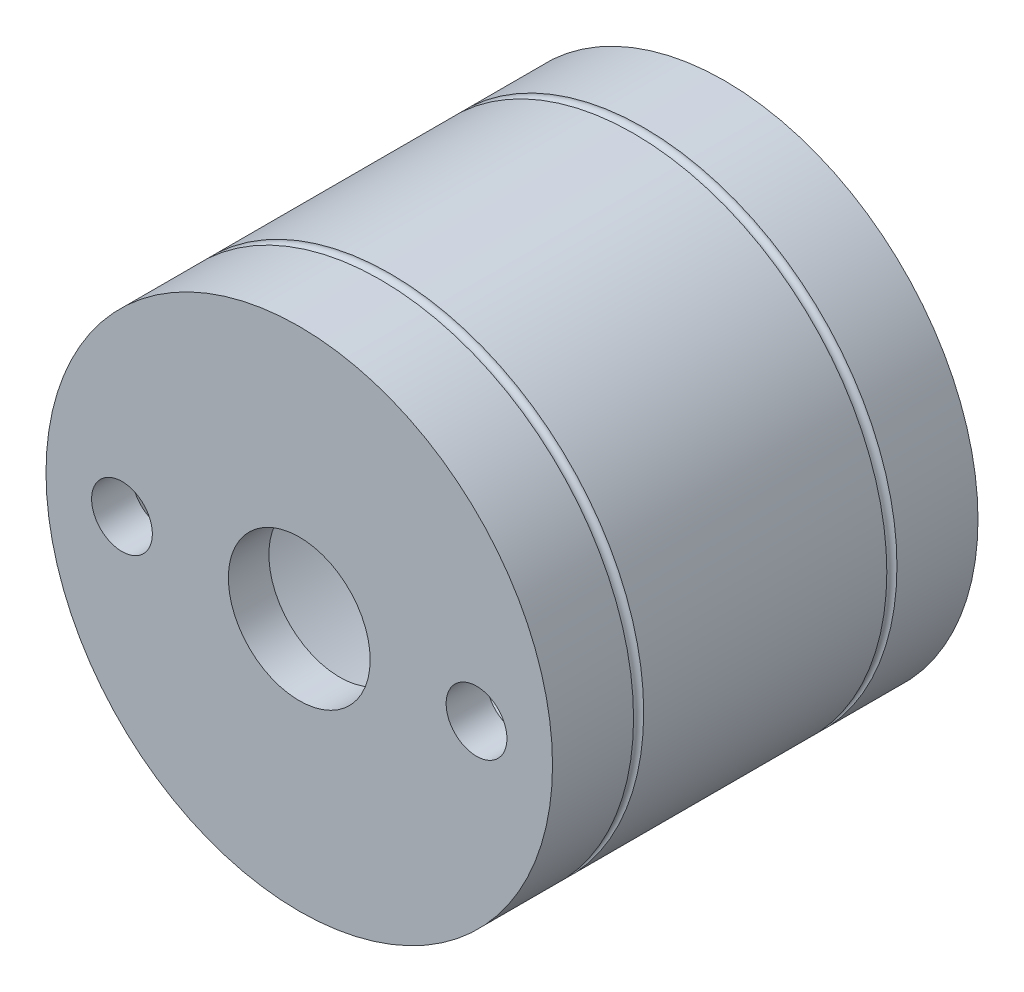
ISO-10303-21;
HEADER;
FILE_DESCRIPTION(('STEP AP214'),'2;1');
FILE_NAME('part.step','',(''),(''),'','','');
FILE_SCHEMA(('AUTOMOTIVE_DESIGN { 1 0 10303 214 1 1 1 1 }'));
ENDSEC;
DATA;
#1=APPLICATION_CONTEXT('core data for automotive mechanical design processes');
#2=APPLICATION_PROTOCOL_DEFINITION('international standard','automotive_design',2000,#1);
#3=PRODUCT_CONTEXT('',#1,'mechanical');
#4=PRODUCT('Part','Part','',(#3));
#5=PRODUCT_RELATED_PRODUCT_CATEGORY('part','',(#4));
#6=PRODUCT_DEFINITION_FORMATION('','',#4);
#7=PRODUCT_DEFINITION_CONTEXT('part definition',#1,'design');
#8=PRODUCT_DEFINITION('design','',#6,#7);
#9=PRODUCT_DEFINITION_SHAPE('','',#8);
#10=(LENGTH_UNIT() NAMED_UNIT(*) SI_UNIT(.MILLI.,.METRE.));
#11=(NAMED_UNIT(*) PLANE_ANGLE_UNIT() SI_UNIT($,.RADIAN.));
#12=(NAMED_UNIT(*) SI_UNIT($,.STERADIAN.) SOLID_ANGLE_UNIT());
#13=UNCERTAINTY_MEASURE_WITH_UNIT(LENGTH_MEASURE(1.E-05),#10,'distance_accuracy_value','');
#14=(GEOMETRIC_REPRESENTATION_CONTEXT(3) GLOBAL_UNCERTAINTY_ASSIGNED_CONTEXT((#13)) GLOBAL_UNIT_ASSIGNED_CONTEXT((#10,
#11,#12)) REPRESENTATION_CONTEXT('',''));
#15=CARTESIAN_POINT('',(0.,0.,0.));
#16=DIRECTION('',(0.,0.,1.));
#17=DIRECTION('',(1.,0.,0.));
#18=AXIS2_PLACEMENT_3D('',#15,#16,#17);
#19=CARTESIAN_POINT('',(0.,0.,21.));
#20=DIRECTION('',(0.,0.,-1.));
#21=DIRECTION('',(-1.,0.,0.));
#22=AXIS2_PLACEMENT_3D('',#19,#20,#21);
#23=CYLINDRICAL_SURFACE('',#22,12.5);
#24=CARTESIAN_POINT('',(0.,0.,4.));
#25=DIRECTION('',(0.,0.,1.));
#26=DIRECTION('',(1.,0.,0.));
#27=AXIS2_PLACEMENT_3D('',#24,#25,#26);
#28=CIRCLE('',#27,12.5);
#29=CARTESIAN_POINT('',(0.,12.5,4.));
#30=VERTEX_POINT('',#29);
#31=EDGE_CURVE('E11',#30,#30,#28,.F.);
#32=ORIENTED_EDGE('',*,*,#31,.T.);
#33=EDGE_LOOP('',(#32));
#34=FACE_BOUND('',#33,.T.);
#35=CARTESIAN_POINT('',(0.,0.,0.));
#36=DIRECTION('',(0.,0.,1.));
#37=DIRECTION('',(1.,0.,0.));
#38=AXIS2_PLACEMENT_3D('',#35,#36,#37);
#39=CIRCLE('',#38,12.5);
#40=CARTESIAN_POINT('',(12.5,0.,0.));
#41=VERTEX_POINT('',#40);
#42=EDGE_CURVE('E81',#41,#41,#39,.T.);
#43=ORIENTED_EDGE('',*,*,#42,.T.);
#44=EDGE_LOOP('',(#43));
#45=FACE_BOUND('',#44,.T.);
#46=ADVANCED_FACE('F32',(#34,#45),#23,.T.);
#47=CARTESIAN_POINT('',(0.,0.,21.));
#48=DIRECTION('',(0.,0.,1.));
#49=DIRECTION('',(1.,0.,0.));
#50=AXIS2_PLACEMENT_3D('',#47,#48,#49);
#51=CIRCLE('',#50,12.5);
#52=CARTESIAN_POINT('',(12.5,0.,21.));
#53=VERTEX_POINT('',#52);
#54=EDGE_CURVE('E85',#53,#53,#51,.T.);
#55=ORIENTED_EDGE('',*,*,#54,.F.);
#56=EDGE_LOOP('',(#55));
#57=FACE_BOUND('',#56,.T.);
#58=CARTESIAN_POINT('',(0.,0.,17.));
#59=DIRECTION('',(0.,0.,-1.));
#60=DIRECTION('',(-1.,0.,0.));
#61=AXIS2_PLACEMENT_3D('',#58,#59,#60);
#62=CIRCLE('',#61,12.5);
#63=CARTESIAN_POINT('',(0.,12.5,17.));
#64=VERTEX_POINT('',#63);
#65=EDGE_CURVE('E62',#64,#64,#62,.T.);
#66=ORIENTED_EDGE('',*,*,#65,.F.);
#67=EDGE_LOOP('',(#66));
#68=FACE_BOUND('',#67,.T.);
#69=ADVANCED_FACE('F34',(#57,#68),#23,.T.);
#70=CARTESIAN_POINT('',(0.,0.,4.5));
#71=DIRECTION('',(0.,0.,-1.));
#72=DIRECTION('',(-1.,0.,0.));
#73=AXIS2_PLACEMENT_3D('',#70,#71,#72);
#74=CIRCLE('',#73,12.5);
#75=CARTESIAN_POINT('',(0.,12.5,4.5));
#76=VERTEX_POINT('',#75);
#77=EDGE_CURVE('E40',#76,#76,#74,.F.);
#78=ORIENTED_EDGE('',*,*,#77,.T.);
#79=EDGE_LOOP('',(#78));
#80=FACE_BOUND('',#79,.T.);
#81=CARTESIAN_POINT('',(0.,0.,16.5));
#82=DIRECTION('',(0.,0.,1.));
#83=DIRECTION('',(1.,0.,0.));
#84=AXIS2_PLACEMENT_3D('',#81,#82,#83);
#85=CIRCLE('',#84,12.5);
#86=CARTESIAN_POINT('',(0.,12.5,16.5));
#87=VERTEX_POINT('',#86);
#88=EDGE_CURVE('E60',#87,#87,#85,.T.);
#89=ORIENTED_EDGE('',*,*,#88,.F.);
#90=EDGE_LOOP('',(#89));
#91=FACE_BOUND('',#90,.T.);
#92=ADVANCED_FACE('F99',(#80,#91),#23,.T.);
#93=CARTESIAN_POINT('',(0.,0.,21.));
#94=DIRECTION('',(0.,0.,1.));
#95=DIRECTION('',(1.,0.,0.));
#96=AXIS2_PLACEMENT_3D('',#93,#94,#95);
#97=PLANE('',#96);
#98=CARTESIAN_POINT('',(8.75,0.,21.));
#99=DIRECTION('',(0.,0.,1.));
#100=DIRECTION('',(1.,0.,0.));
#101=AXIS2_PLACEMENT_3D('',#98,#99,#100);
#102=CIRCLE('',#101,1.5);
#103=CARTESIAN_POINT('',(10.25,0.,21.));
#104=VERTEX_POINT('',#103);
#105=EDGE_CURVE('E66',#104,#104,#102,.T.);
#106=ORIENTED_EDGE('',*,*,#105,.F.);
#107=EDGE_LOOP('',(#106));
#108=FACE_BOUND('',#107,.T.);
#109=CARTESIAN_POINT('',(-8.75,0.,21.));
#110=DIRECTION('',(0.,0.,1.));
#111=DIRECTION('',(-1.,0.,0.));
#112=AXIS2_PLACEMENT_3D('',#109,#110,#111);
#113=CIRCLE('',#112,1.5);
#114=CARTESIAN_POINT('',(-7.25,0.,21.));
#115=VERTEX_POINT('',#114);
#116=EDGE_CURVE('E63',#115,#115,#113,.T.);
#117=ORIENTED_EDGE('',*,*,#116,.F.);
#118=EDGE_LOOP('',(#117));
#119=FACE_BOUND('',#118,.T.);
#120=CARTESIAN_POINT('',(0.,0.,21.));
#121=DIRECTION('',(0.,0.,1.));
#122=DIRECTION('',(1.,0.,0.));
#123=AXIS2_PLACEMENT_3D('',#120,#121,#122);
#124=CIRCLE('',#123,3.5);
#125=CARTESIAN_POINT('',(3.5,0.,21.));
#126=VERTEX_POINT('',#125);
#127=EDGE_CURVE('E73',#126,#126,#124,.T.);
#128=ORIENTED_EDGE('',*,*,#127,.F.);
#129=EDGE_LOOP('',(#128));
#130=FACE_BOUND('',#129,.T.);
#131=ORIENTED_EDGE('',*,*,#54,.T.);
#132=EDGE_LOOP('',(#131));
#133=FACE_BOUND('',#132,.T.);
#134=ADVANCED_FACE('F117',(#108,#119,#130,#133),#97,.T.);
#135=CARTESIAN_POINT('',(0.,0.,0.));
#136=DIRECTION('',(0.,0.,1.));
#137=DIRECTION('',(1.,0.,0.));
#138=AXIS2_PLACEMENT_3D('',#135,#136,#137);
#139=PLANE('',#138);
#140=CARTESIAN_POINT('',(0.,0.,0.));
#141=DIRECTION('',(0.,0.,1.));
#142=DIRECTION('',(1.,0.,0.));
#143=AXIS2_PLACEMENT_3D('',#140,#141,#142);
#144=CIRCLE('',#143,10.5);
#145=CARTESIAN_POINT('',(-10.5,0.,0.));
#146=VERTEX_POINT('',#145);
#147=EDGE_CURVE('E82',#146,#146,#144,.T.);
#148=ORIENTED_EDGE('',*,*,#147,.T.);
#149=EDGE_LOOP('',(#148));
#150=FACE_BOUND('',#149,.T.);
#151=ORIENTED_EDGE('',*,*,#42,.F.);
#152=EDGE_LOOP('',(#151));
#153=FACE_BOUND('',#152,.T.);
#154=ADVANCED_FACE('F121',(#150,#153),#139,.F.);
#155=CARTESIAN_POINT('',(0.,0.,21.));
#156=DIRECTION('',(0.,0.,-1.));
#157=DIRECTION('',(-1.,0.,0.));
#158=AXIS2_PLACEMENT_3D('',#155,#156,#157);
#159=CYLINDRICAL_SURFACE('',#158,10.5);
#160=CARTESIAN_POINT('',(0.,0.,19.));
#161=DIRECTION('',(0.,0.,1.));
#162=DIRECTION('',(1.,0.,0.));
#163=AXIS2_PLACEMENT_3D('',#160,#161,#162);
#164=CIRCLE('',#163,10.5);
#165=CARTESIAN_POINT('',(-10.5,0.,19.));
#166=VERTEX_POINT('',#165);
#167=EDGE_CURVE('E78',#166,#166,#164,.T.);
#168=CARTESIAN_POINT('',(-10.5,0.,19.));
#169=CARTESIAN_POINT('',(-10.5,0.,18.8020833333333));
#170=CARTESIAN_POINT('',(-10.5,0.,18.6041666666667));
#171=CARTESIAN_POINT('',(-10.5,0.,18.2083333333333));
#172=CARTESIAN_POINT('',(-10.5,0.,18.0104166666667));
#173=CARTESIAN_POINT('',(-10.5,0.,17.6145833333333));
#174=CARTESIAN_POINT('',(-10.5,0.,17.4166666666667));
#175=CARTESIAN_POINT('',(-10.5,0.,17.0208333333333));
#176=CARTESIAN_POINT('',(-10.5,0.,16.8229166666667));
#177=CARTESIAN_POINT('',(-10.5,0.,16.4270833333333));
#178=CARTESIAN_POINT('',(-10.5,0.,16.2291666666667));
#179=CARTESIAN_POINT('',(-10.5,0.,15.8333333333333));
#180=CARTESIAN_POINT('',(-10.5,0.,15.6354166666667));
#181=CARTESIAN_POINT('',(-10.5,0.,15.2395833333333));
#182=CARTESIAN_POINT('',(-10.5,0.,15.0416666666667));
#183=CARTESIAN_POINT('',(-10.5,0.,14.6458333333333));
#184=CARTESIAN_POINT('',(-10.5,0.,14.4479166666667));
#185=CARTESIAN_POINT('',(-10.5,0.,14.0520833333333));
#186=CARTESIAN_POINT('',(-10.5,0.,13.8541666666667));
#187=CARTESIAN_POINT('',(-10.5,0.,13.4583333333333));
#188=CARTESIAN_POINT('',(-10.5,0.,13.2604166666667));
#189=CARTESIAN_POINT('',(-10.5,0.,12.8645833333333));
#190=CARTESIAN_POINT('',(-10.5,0.,12.6666666666667));
#191=CARTESIAN_POINT('',(-10.5,0.,12.2708333333333));
#192=CARTESIAN_POINT('',(-10.5,0.,12.0729166666667));
#193=CARTESIAN_POINT('',(-10.5,0.,11.6770833333333));
#194=CARTESIAN_POINT('',(-10.5,0.,11.4791666666667));
#195=CARTESIAN_POINT('',(-10.5,0.,11.0833333333333));
#196=CARTESIAN_POINT('',(-10.5,0.,10.8854166666667));
#197=CARTESIAN_POINT('',(-10.5,0.,10.4895833333333));
#198=CARTESIAN_POINT('',(-10.5,0.,10.2916666666667));
#199=CARTESIAN_POINT('',(-10.5,0.,9.89583333333333));
#200=CARTESIAN_POINT('',(-10.5,0.,9.69791666666667));
#201=CARTESIAN_POINT('',(-10.5,0.,9.30208333333333));
#202=CARTESIAN_POINT('',(-10.5,0.,9.10416666666667));
#203=CARTESIAN_POINT('',(-10.5,0.,8.70833333333333));
#204=CARTESIAN_POINT('',(-10.5,0.,8.51041666666667));
#205=CARTESIAN_POINT('',(-10.5,0.,8.11458333333333));
#206=CARTESIAN_POINT('',(-10.5,0.,7.91666666666667));
#207=CARTESIAN_POINT('',(-10.5,0.,7.52083333333333));
#208=CARTESIAN_POINT('',(-10.5,0.,7.32291666666667));
#209=CARTESIAN_POINT('',(-10.5,0.,6.92708333333333));
#210=CARTESIAN_POINT('',(-10.5,0.,6.72916666666667));
#211=CARTESIAN_POINT('',(-10.5,0.,6.33333333333333));
#212=CARTESIAN_POINT('',(-10.5,0.,6.13541666666667));
#213=CARTESIAN_POINT('',(-10.5,0.,5.73958333333333));
#214=CARTESIAN_POINT('',(-10.5,0.,5.54166666666667));
#215=CARTESIAN_POINT('',(-10.5,0.,5.14583333333333));
#216=CARTESIAN_POINT('',(-10.5,0.,4.94791666666667));
#217=CARTESIAN_POINT('',(-10.5,0.,4.55208333333333));
#218=CARTESIAN_POINT('',(-10.5,0.,4.35416666666667));
#219=CARTESIAN_POINT('',(-10.5,0.,3.95833333333333));
#220=CARTESIAN_POINT('',(-10.5,0.,3.76041666666667));
#221=CARTESIAN_POINT('',(-10.5,0.,3.36458333333333));
#222=CARTESIAN_POINT('',(-10.5,0.,3.16666666666667));
#223=CARTESIAN_POINT('',(-10.5,0.,2.77083333333333));
#224=CARTESIAN_POINT('',(-10.5,0.,2.57291666666667));
#225=CARTESIAN_POINT('',(-10.5,0.,2.17708333333334));
#226=CARTESIAN_POINT('',(-10.5,0.,1.97916666666667));
#227=CARTESIAN_POINT('',(-10.5,0.,1.58333333333333));
#228=CARTESIAN_POINT('',(-10.5,0.,1.38541666666667));
#229=CARTESIAN_POINT('',(-10.5,0.,0.989583333333334));
#230=CARTESIAN_POINT('',(-10.5,0.,0.791666666666667));
#231=CARTESIAN_POINT('',(-10.5,0.,0.395833333333334));
#232=CARTESIAN_POINT('',(-10.5,0.,0.197916666666667));
#233=CARTESIAN_POINT('',(-10.5,0.,0.));
#234=B_SPLINE_CURVE_WITH_KNOTS('',3,(#168,#169,#170,#171,#172,#173,#174,#175,#176,#177,#178,
#179,#180,#181,#182,#183,#184,#185,#186,#187,#188,#189,#190,#191,#192,#193,#194,#195,#196,#197,
#198,#199,#200,#201,#202,#203,#204,#205,#206,#207,#208,#209,#210,#211,#212,#213,#214,#215,#216,
#217,#218,#219,#220,#221,#222,#223,#224,#225,#226,#227,#228,#229,#230,#231,#232,#233),
.UNSPECIFIED.,.F.,.F.,(4,2,2,2,2,2,2,2,2,2,2,2,2,2,2,2,2,2,2,2,2,2,2,2,2,2,2,2,2,2,2,2,4),(0.,
0.593750000000001,1.1875,1.78125,2.375,2.96875,3.5625,4.15625,4.75,5.34375,5.9375,6.53125,7.125,
7.71875,8.3125,8.90625,9.5,10.09375,10.6875,11.28125,11.875,12.46875,13.0625,13.65625,14.25,
14.84375,15.4375,16.03125,16.625,17.21875,17.8125,18.40625,19.),.UNSPECIFIED.);
#235=EDGE_CURVE('BSEAM127',#166,#146,#234,.T.);
#236=ORIENTED_EDGE('',*,*,#167,.T.);
#237=ORIENTED_EDGE('',*,*,#147,.F.);
#238=ORIENTED_EDGE('',*,*,#235,.T.);
#239=ORIENTED_EDGE('',*,*,#235,.F.);
#240=EDGE_LOOP('',(#236,#238,#237,#239));
#241=FACE_BOUND('',#240,.T.);
#242=ADVANCED_FACE('F127',(#241),#159,.F.);
#243=CARTESIAN_POINT('',(0.,0.,19.));
#244=DIRECTION('',(0.,0.,1.));
#245=DIRECTION('',(1.,0.,0.));
#246=AXIS2_PLACEMENT_3D('',#243,#244,#245);
#247=PLANE('',#246);
#248=CARTESIAN_POINT('',(8.75,0.,19.));
#249=DIRECTION('',(0.,0.,1.));
#250=DIRECTION('',(1.,0.,0.));
#251=AXIS2_PLACEMENT_3D('',#248,#249,#250);
#252=CIRCLE('',#251,1.5);
#253=CARTESIAN_POINT('',(10.25,0.,19.));
#254=VERTEX_POINT('',#253);
#255=EDGE_CURVE('E77',#254,#254,#252,.T.);
#256=ORIENTED_EDGE('',*,*,#255,.T.);
#257=EDGE_LOOP('',(#256));
#258=FACE_BOUND('',#257,.T.);
#259=CARTESIAN_POINT('',(-8.75,0.,19.));
#260=DIRECTION('',(0.,0.,1.));
#261=DIRECTION('',(1.,0.,0.));
#262=AXIS2_PLACEMENT_3D('',#259,#260,#261);
#263=CIRCLE('',#262,1.5);
#264=CARTESIAN_POINT('',(-7.25,0.,19.));
#265=VERTEX_POINT('',#264);
#266=EDGE_CURVE('E71',#265,#265,#263,.T.);
#267=ORIENTED_EDGE('',*,*,#266,.T.);
#268=EDGE_LOOP('',(#267));
#269=FACE_BOUND('',#268,.T.);
#270=CARTESIAN_POINT('',(0.,0.,19.));
#271=DIRECTION('',(0.,0.,1.));
#272=DIRECTION('',(1.,0.,0.));
#273=AXIS2_PLACEMENT_3D('',#270,#271,#272);
#274=CIRCLE('',#273,3.5);
#275=CARTESIAN_POINT('',(3.5,0.,19.));
#276=VERTEX_POINT('',#275);
#277=EDGE_CURVE('E76',#276,#276,#274,.T.);
#278=ORIENTED_EDGE('',*,*,#277,.T.);
#279=EDGE_LOOP('',(#278));
#280=FACE_BOUND('',#279,.T.);
#281=ORIENTED_EDGE('',*,*,#167,.F.);
#282=EDGE_LOOP('',(#281));
#283=FACE_BOUND('',#282,.T.);
#284=ADVANCED_FACE('F132',(#258,#269,#280,#283),#247,.F.);
#285=CARTESIAN_POINT('',(0.,0.,0.));
#286=DIRECTION('',(0.,0.,1.));
#287=DIRECTION('',(1.,0.,0.));
#288=AXIS2_PLACEMENT_3D('',#285,#286,#287);
#289=CYLINDRICAL_SURFACE('',#288,3.5);
#290=CARTESIAN_POINT('',(3.5,0.,21.));
#291=CARTESIAN_POINT('',(3.5,0.,20.9791666666667));
#292=CARTESIAN_POINT('',(3.5,0.,20.9583333333333));
#293=CARTESIAN_POINT('',(3.5,0.,20.9166666666667));
#294=CARTESIAN_POINT('',(3.5,0.,20.8958333333333));
#295=CARTESIAN_POINT('',(3.5,0.,20.8541666666667));
#296=CARTESIAN_POINT('',(3.5,0.,20.8333333333333));
#297=CARTESIAN_POINT('',(3.5,0.,20.7916666666667));
#298=CARTESIAN_POINT('',(3.5,0.,20.7708333333333));
#299=CARTESIAN_POINT('',(3.5,0.,20.7291666666667));
#300=CARTESIAN_POINT('',(3.5,0.,20.7083333333333));
#301=CARTESIAN_POINT('',(3.5,0.,20.6666666666667));
#302=CARTESIAN_POINT('',(3.5,0.,20.6458333333333));
#303=CARTESIAN_POINT('',(3.5,0.,20.6041666666667));
#304=CARTESIAN_POINT('',(3.5,0.,20.5833333333333));
#305=CARTESIAN_POINT('',(3.5,0.,20.5416666666667));
#306=CARTESIAN_POINT('',(3.5,0.,20.5208333333333));
#307=CARTESIAN_POINT('',(3.5,0.,20.4791666666667));
#308=CARTESIAN_POINT('',(3.5,0.,20.4583333333333));
#309=CARTESIAN_POINT('',(3.5,0.,20.4166666666667));
#310=CARTESIAN_POINT('',(3.5,0.,20.3958333333333));
#311=CARTESIAN_POINT('',(3.5,0.,20.3541666666667));
#312=CARTESIAN_POINT('',(3.5,0.,20.3333333333333));
#313=CARTESIAN_POINT('',(3.5,0.,20.2916666666667));
#314=CARTESIAN_POINT('',(3.5,0.,20.2708333333333));
#315=CARTESIAN_POINT('',(3.5,0.,20.2291666666667));
#316=CARTESIAN_POINT('',(3.5,0.,20.2083333333333));
#317=CARTESIAN_POINT('',(3.5,0.,20.1666666666667));
#318=CARTESIAN_POINT('',(3.5,0.,20.1458333333333));
#319=CARTESIAN_POINT('',(3.5,0.,20.1041666666667));
#320=CARTESIAN_POINT('',(3.5,0.,20.0833333333333));
#321=CARTESIAN_POINT('',(3.5,0.,20.0416666666667));
#322=CARTESIAN_POINT('',(3.5,0.,20.0208333333333));
#323=CARTESIAN_POINT('',(3.5,0.,19.9791666666667));
#324=CARTESIAN_POINT('',(3.5,0.,19.9583333333333));
#325=CARTESIAN_POINT('',(3.5,0.,19.9166666666667));
#326=CARTESIAN_POINT('',(3.5,0.,19.8958333333333));
#327=CARTESIAN_POINT('',(3.5,0.,19.8541666666667));
#328=CARTESIAN_POINT('',(3.5,0.,19.8333333333333));
#329=CARTESIAN_POINT('',(3.5,0.,19.7916666666667));
#330=CARTESIAN_POINT('',(3.5,0.,19.7708333333333));
#331=CARTESIAN_POINT('',(3.5,0.,19.7291666666667));
#332=CARTESIAN_POINT('',(3.5,0.,19.7083333333333));
#333=CARTESIAN_POINT('',(3.5,0.,19.6666666666667));
#334=CARTESIAN_POINT('',(3.5,0.,19.6458333333333));
#335=CARTESIAN_POINT('',(3.5,0.,19.6041666666667));
#336=CARTESIAN_POINT('',(3.5,0.,19.5833333333333));
#337=CARTESIAN_POINT('',(3.5,0.,19.5416666666667));
#338=CARTESIAN_POINT('',(3.5,0.,19.5208333333333));
#339=CARTESIAN_POINT('',(3.5,0.,19.4791666666667));
#340=CARTESIAN_POINT('',(3.5,0.,19.4583333333333));
#341=CARTESIAN_POINT('',(3.5,0.,19.4166666666667));
#342=CARTESIAN_POINT('',(3.5,0.,19.3958333333333));
#343=CARTESIAN_POINT('',(3.5,0.,19.3541666666667));
#344=CARTESIAN_POINT('',(3.5,0.,19.3333333333333));
#345=CARTESIAN_POINT('',(3.5,0.,19.2916666666667));
#346=CARTESIAN_POINT('',(3.5,0.,19.2708333333333));
#347=CARTESIAN_POINT('',(3.5,0.,19.2291666666667));
#348=CARTESIAN_POINT('',(3.5,0.,19.2083333333333));
#349=CARTESIAN_POINT('',(3.5,0.,19.1666666666667));
#350=CARTESIAN_POINT('',(3.5,0.,19.1458333333333));
#351=CARTESIAN_POINT('',(3.5,0.,19.1041666666667));
#352=CARTESIAN_POINT('',(3.5,0.,19.0833333333333));
#353=CARTESIAN_POINT('',(3.5,0.,19.0416666666667));
#354=CARTESIAN_POINT('',(3.5,0.,19.0208333333333));
#355=CARTESIAN_POINT('',(3.5,0.,19.));
#356=B_SPLINE_CURVE_WITH_KNOTS('',3,(#290,#291,#292,#293,#294,#295,#296,#297,#298,#299,#300,
#301,#302,#303,#304,#305,#306,#307,#308,#309,#310,#311,#312,#313,#314,#315,#316,#317,#318,#319,
#320,#321,#322,#323,#324,#325,#326,#327,#328,#329,#330,#331,#332,#333,#334,#335,#336,#337,#338,
#339,#340,#341,#342,#343,#344,#345,#346,#347,#348,#349,#350,#351,#352,#353,#354,#355),
.UNSPECIFIED.,.F.,.F.,(4,2,2,2,2,2,2,2,2,2,2,2,2,2,2,2,2,2,2,2,2,2,2,2,2,2,2,2,2,2,2,2,4),(0.,
0.0625000000000001,0.125,0.1875,0.25,0.3125,0.375,0.4375,0.5,0.5625,0.625000000000001,
0.687500000000001,0.750000000000001,0.812500000000001,0.875000000000001,0.937500000000001,1.,
1.0625,1.125,1.1875,1.25,1.3125,1.375,1.4375,1.5,1.5625,1.625,1.6875,1.75,1.8125,1.875,1.9375,
2.),.UNSPECIFIED.);
#357=EDGE_CURVE('BSEAM135',#126,#276,#356,.T.);
#358=ORIENTED_EDGE('',*,*,#127,.T.);
#359=ORIENTED_EDGE('',*,*,#277,.F.);
#360=ORIENTED_EDGE('',*,*,#357,.T.);
#361=ORIENTED_EDGE('',*,*,#357,.F.);
#362=EDGE_LOOP('',(#358,#360,#359,#361));
#363=FACE_BOUND('',#362,.T.);
#364=ADVANCED_FACE('F135',(#363),#289,.F.);
#365=CARTESIAN_POINT('',(-8.75,0.,0.));
#366=DIRECTION('',(0.,0.,1.));
#367=DIRECTION('',(1.,0.,0.));
#368=AXIS2_PLACEMENT_3D('',#365,#366,#367);
#369=CYLINDRICAL_SURFACE('',#368,1.5);
#370=CARTESIAN_POINT('',(-7.25,0.,21.));
#371=CARTESIAN_POINT('',(-7.25,0.,20.9791666666667));
#372=CARTESIAN_POINT('',(-7.25,0.,20.9583333333333));
#373=CARTESIAN_POINT('',(-7.25,0.,20.9166666666667));
#374=CARTESIAN_POINT('',(-7.25,0.,20.8958333333333));
#375=CARTESIAN_POINT('',(-7.25,0.,20.8541666666667));
#376=CARTESIAN_POINT('',(-7.25,0.,20.8333333333333));
#377=CARTESIAN_POINT('',(-7.25,0.,20.7916666666667));
#378=CARTESIAN_POINT('',(-7.25,0.,20.7708333333333));
#379=CARTESIAN_POINT('',(-7.25,0.,20.7291666666667));
#380=CARTESIAN_POINT('',(-7.25,0.,20.7083333333333));
#381=CARTESIAN_POINT('',(-7.25,0.,20.6666666666667));
#382=CARTESIAN_POINT('',(-7.25,0.,20.6458333333333));
#383=CARTESIAN_POINT('',(-7.25,0.,20.6041666666667));
#384=CARTESIAN_POINT('',(-7.25,0.,20.5833333333333));
#385=CARTESIAN_POINT('',(-7.25,0.,20.5416666666667));
#386=CARTESIAN_POINT('',(-7.25,0.,20.5208333333333));
#387=CARTESIAN_POINT('',(-7.25,0.,20.4791666666667));
#388=CARTESIAN_POINT('',(-7.25,0.,20.4583333333333));
#389=CARTESIAN_POINT('',(-7.25,0.,20.4166666666667));
#390=CARTESIAN_POINT('',(-7.25,0.,20.3958333333333));
#391=CARTESIAN_POINT('',(-7.25,0.,20.3541666666667));
#392=CARTESIAN_POINT('',(-7.25,0.,20.3333333333333));
#393=CARTESIAN_POINT('',(-7.25,0.,20.2916666666667));
#394=CARTESIAN_POINT('',(-7.25,0.,20.2708333333333));
#395=CARTESIAN_POINT('',(-7.25,0.,20.2291666666667));
#396=CARTESIAN_POINT('',(-7.25,0.,20.2083333333333));
#397=CARTESIAN_POINT('',(-7.25,0.,20.1666666666667));
#398=CARTESIAN_POINT('',(-7.25,0.,20.1458333333333));
#399=CARTESIAN_POINT('',(-7.25,0.,20.1041666666667));
#400=CARTESIAN_POINT('',(-7.25,0.,20.0833333333333));
#401=CARTESIAN_POINT('',(-7.25,0.,20.0416666666667));
#402=CARTESIAN_POINT('',(-7.25,0.,20.0208333333333));
#403=CARTESIAN_POINT('',(-7.25,0.,19.9791666666667));
#404=CARTESIAN_POINT('',(-7.25,0.,19.9583333333333));
#405=CARTESIAN_POINT('',(-7.25,0.,19.9166666666667));
#406=CARTESIAN_POINT('',(-7.25,0.,19.8958333333333));
#407=CARTESIAN_POINT('',(-7.25,0.,19.8541666666667));
#408=CARTESIAN_POINT('',(-7.25,0.,19.8333333333333));
#409=CARTESIAN_POINT('',(-7.25,0.,19.7916666666667));
#410=CARTESIAN_POINT('',(-7.25,0.,19.7708333333333));
#411=CARTESIAN_POINT('',(-7.25,0.,19.7291666666667));
#412=CARTESIAN_POINT('',(-7.25,0.,19.7083333333333));
#413=CARTESIAN_POINT('',(-7.25,0.,19.6666666666667));
#414=CARTESIAN_POINT('',(-7.25,0.,19.6458333333333));
#415=CARTESIAN_POINT('',(-7.25,0.,19.6041666666667));
#416=CARTESIAN_POINT('',(-7.25,0.,19.5833333333333));
#417=CARTESIAN_POINT('',(-7.25,0.,19.5416666666667));
#418=CARTESIAN_POINT('',(-7.25,0.,19.5208333333333));
#419=CARTESIAN_POINT('',(-7.25,0.,19.4791666666667));
#420=CARTESIAN_POINT('',(-7.25,0.,19.4583333333333));
#421=CARTESIAN_POINT('',(-7.25,0.,19.4166666666667));
#422=CARTESIAN_POINT('',(-7.25,0.,19.3958333333333));
#423=CARTESIAN_POINT('',(-7.25,0.,19.3541666666667));
#424=CARTESIAN_POINT('',(-7.25,0.,19.3333333333333));
#425=CARTESIAN_POINT('',(-7.25,0.,19.2916666666667));
#426=CARTESIAN_POINT('',(-7.25,0.,19.2708333333333));
#427=CARTESIAN_POINT('',(-7.25,0.,19.2291666666667));
#428=CARTESIAN_POINT('',(-7.25,0.,19.2083333333333));
#429=CARTESIAN_POINT('',(-7.25,0.,19.1666666666667));
#430=CARTESIAN_POINT('',(-7.25,0.,19.1458333333333));
#431=CARTESIAN_POINT('',(-7.25,0.,19.1041666666667));
#432=CARTESIAN_POINT('',(-7.25,0.,19.0833333333333));
#433=CARTESIAN_POINT('',(-7.25,0.,19.0416666666667));
#434=CARTESIAN_POINT('',(-7.25,0.,19.0208333333333));
#435=CARTESIAN_POINT('',(-7.25,0.,19.));
#436=B_SPLINE_CURVE_WITH_KNOTS('',3,(#370,#371,#372,#373,#374,#375,#376,#377,#378,#379,#380,
#381,#382,#383,#384,#385,#386,#387,#388,#389,#390,#391,#392,#393,#394,#395,#396,#397,#398,#399,
#400,#401,#402,#403,#404,#405,#406,#407,#408,#409,#410,#411,#412,#413,#414,#415,#416,#417,#418,
#419,#420,#421,#422,#423,#424,#425,#426,#427,#428,#429,#430,#431,#432,#433,#434,#435),
.UNSPECIFIED.,.F.,.F.,(4,2,2,2,2,2,2,2,2,2,2,2,2,2,2,2,2,2,2,2,2,2,2,2,2,2,2,2,2,2,2,2,4),(0.,
0.0625000000000001,0.125,0.1875,0.25,0.3125,0.375,0.4375,0.5,0.5625,0.625000000000001,
0.687500000000001,0.750000000000001,0.812500000000001,0.875000000000001,0.937500000000001,1.,
1.0625,1.125,1.1875,1.25,1.3125,1.375,1.4375,1.5,1.5625,1.625,1.6875,1.75,1.8125,1.875,1.9375,
2.),.UNSPECIFIED.);
#437=EDGE_CURVE('BSEAM142',#115,#265,#436,.T.);
#438=ORIENTED_EDGE('',*,*,#116,.T.);
#439=ORIENTED_EDGE('',*,*,#266,.F.);
#440=ORIENTED_EDGE('',*,*,#437,.T.);
#441=ORIENTED_EDGE('',*,*,#437,.F.);
#442=EDGE_LOOP('',(#438,#440,#439,#441));
#443=FACE_BOUND('',#442,.T.);
#444=ADVANCED_FACE('F142',(#443),#369,.F.);
#445=CARTESIAN_POINT('',(8.75,0.,0.));
#446=DIRECTION('',(0.,0.,1.));
#447=DIRECTION('',(1.,0.,0.));
#448=AXIS2_PLACEMENT_3D('',#445,#446,#447);
#449=CYLINDRICAL_SURFACE('',#448,1.5);
#450=CARTESIAN_POINT('',(10.25,0.,21.));
#451=CARTESIAN_POINT('',(10.25,0.,20.9791666666667));
#452=CARTESIAN_POINT('',(10.25,0.,20.9583333333333));
#453=CARTESIAN_POINT('',(10.25,0.,20.9166666666667));
#454=CARTESIAN_POINT('',(10.25,0.,20.8958333333333));
#455=CARTESIAN_POINT('',(10.25,0.,20.8541666666667));
#456=CARTESIAN_POINT('',(10.25,0.,20.8333333333333));
#457=CARTESIAN_POINT('',(10.25,0.,20.7916666666667));
#458=CARTESIAN_POINT('',(10.25,0.,20.7708333333333));
#459=CARTESIAN_POINT('',(10.25,0.,20.7291666666667));
#460=CARTESIAN_POINT('',(10.25,0.,20.7083333333333));
#461=CARTESIAN_POINT('',(10.25,0.,20.6666666666667));
#462=CARTESIAN_POINT('',(10.25,0.,20.6458333333333));
#463=CARTESIAN_POINT('',(10.25,0.,20.6041666666667));
#464=CARTESIAN_POINT('',(10.25,0.,20.5833333333333));
#465=CARTESIAN_POINT('',(10.25,0.,20.5416666666667));
#466=CARTESIAN_POINT('',(10.25,0.,20.5208333333333));
#467=CARTESIAN_POINT('',(10.25,0.,20.4791666666667));
#468=CARTESIAN_POINT('',(10.25,0.,20.4583333333333));
#469=CARTESIAN_POINT('',(10.25,0.,20.4166666666667));
#470=CARTESIAN_POINT('',(10.25,0.,20.3958333333333));
#471=CARTESIAN_POINT('',(10.25,0.,20.3541666666667));
#472=CARTESIAN_POINT('',(10.25,0.,20.3333333333333));
#473=CARTESIAN_POINT('',(10.25,0.,20.2916666666667));
#474=CARTESIAN_POINT('',(10.25,0.,20.2708333333333));
#475=CARTESIAN_POINT('',(10.25,0.,20.2291666666667));
#476=CARTESIAN_POINT('',(10.25,0.,20.2083333333333));
#477=CARTESIAN_POINT('',(10.25,0.,20.1666666666667));
#478=CARTESIAN_POINT('',(10.25,0.,20.1458333333333));
#479=CARTESIAN_POINT('',(10.25,0.,20.1041666666667));
#480=CARTESIAN_POINT('',(10.25,0.,20.0833333333333));
#481=CARTESIAN_POINT('',(10.25,0.,20.0416666666667));
#482=CARTESIAN_POINT('',(10.25,0.,20.0208333333333));
#483=CARTESIAN_POINT('',(10.25,0.,19.9791666666667));
#484=CARTESIAN_POINT('',(10.25,0.,19.9583333333333));
#485=CARTESIAN_POINT('',(10.25,0.,19.9166666666667));
#486=CARTESIAN_POINT('',(10.25,0.,19.8958333333333));
#487=CARTESIAN_POINT('',(10.25,0.,19.8541666666667));
#488=CARTESIAN_POINT('',(10.25,0.,19.8333333333333));
#489=CARTESIAN_POINT('',(10.25,0.,19.7916666666667));
#490=CARTESIAN_POINT('',(10.25,0.,19.7708333333333));
#491=CARTESIAN_POINT('',(10.25,0.,19.7291666666667));
#492=CARTESIAN_POINT('',(10.25,0.,19.7083333333333));
#493=CARTESIAN_POINT('',(10.25,0.,19.6666666666667));
#494=CARTESIAN_POINT('',(10.25,0.,19.6458333333333));
#495=CARTESIAN_POINT('',(10.25,0.,19.6041666666667));
#496=CARTESIAN_POINT('',(10.25,0.,19.5833333333333));
#497=CARTESIAN_POINT('',(10.25,0.,19.5416666666667));
#498=CARTESIAN_POINT('',(10.25,0.,19.5208333333333));
#499=CARTESIAN_POINT('',(10.25,0.,19.4791666666667));
#500=CARTESIAN_POINT('',(10.25,0.,19.4583333333333));
#501=CARTESIAN_POINT('',(10.25,0.,19.4166666666667));
#502=CARTESIAN_POINT('',(10.25,0.,19.3958333333333));
#503=CARTESIAN_POINT('',(10.25,0.,19.3541666666667));
#504=CARTESIAN_POINT('',(10.25,0.,19.3333333333333));
#505=CARTESIAN_POINT('',(10.25,0.,19.2916666666667));
#506=CARTESIAN_POINT('',(10.25,0.,19.2708333333333));
#507=CARTESIAN_POINT('',(10.25,0.,19.2291666666667));
#508=CARTESIAN_POINT('',(10.25,0.,19.2083333333333));
#509=CARTESIAN_POINT('',(10.25,0.,19.1666666666667));
#510=CARTESIAN_POINT('',(10.25,0.,19.1458333333333));
#511=CARTESIAN_POINT('',(10.25,0.,19.1041666666667));
#512=CARTESIAN_POINT('',(10.25,0.,19.0833333333333));
#513=CARTESIAN_POINT('',(10.25,0.,19.0416666666667));
#514=CARTESIAN_POINT('',(10.25,0.,19.0208333333333));
#515=CARTESIAN_POINT('',(10.25,0.,19.));
#516=B_SPLINE_CURVE_WITH_KNOTS('',3,(#450,#451,#452,#453,#454,#455,#456,#457,#458,#459,#460,
#461,#462,#463,#464,#465,#466,#467,#468,#469,#470,#471,#472,#473,#474,#475,#476,#477,#478,#479,
#480,#481,#482,#483,#484,#485,#486,#487,#488,#489,#490,#491,#492,#493,#494,#495,#496,#497,#498,
#499,#500,#501,#502,#503,#504,#505,#506,#507,#508,#509,#510,#511,#512,#513,#514,#515),
.UNSPECIFIED.,.F.,.F.,(4,2,2,2,2,2,2,2,2,2,2,2,2,2,2,2,2,2,2,2,2,2,2,2,2,2,2,2,2,2,2,2,4),(0.,
0.0625000000000001,0.125,0.1875,0.25,0.3125,0.375,0.4375,0.5,0.5625,0.625000000000001,
0.687500000000001,0.750000000000001,0.812500000000001,0.875000000000001,0.937500000000001,1.,
1.0625,1.125,1.1875,1.25,1.3125,1.375,1.4375,1.5,1.5625,1.625,1.6875,1.75,1.8125,1.875,1.9375,
2.),.UNSPECIFIED.);
#517=EDGE_CURVE('BSEAM107',#104,#254,#516,.T.);
#518=ORIENTED_EDGE('',*,*,#105,.T.);
#519=ORIENTED_EDGE('',*,*,#255,.F.);
#520=ORIENTED_EDGE('',*,*,#517,.T.);
#521=ORIENTED_EDGE('',*,*,#517,.F.);
#522=EDGE_LOOP('',(#518,#520,#519,#521));
#523=FACE_BOUND('',#522,.T.);
#524=ADVANCED_FACE('F107',(#523),#449,.F.);
#525=CARTESIAN_POINT('',(0.,0.,16.75));
#526=DIRECTION('',(0.,0.,1.));
#527=DIRECTION('',(1.,0.,0.));
#528=AXIS2_PLACEMENT_3D('',#525,#526,#527);
#529=TOROIDAL_SURFACE('',#528,12.5,0.25);
#530=ORIENTED_EDGE('',*,*,#65,.T.);
#531=CARTESIAN_POINT('',(0.,12.5,16.75));
#532=DIRECTION('',(1.,0.,0.));
#533=DIRECTION('',(0.,0.,-1.));
#534=AXIS2_PLACEMENT_3D('',#531,#532,#533);
#535=CIRCLE('',#534,0.25);
#536=EDGE_CURVE('E57',#64,#87,#535,.T.);
#537=ORIENTED_EDGE('',*,*,#536,.T.);
#538=ORIENTED_EDGE('',*,*,#88,.T.);
#539=ORIENTED_EDGE('',*,*,#536,.F.);
#540=EDGE_LOOP('',(#530,#537,#538,#539));
#541=FACE_BOUND('',#540,.T.);
#542=ADVANCED_FACE('F58',(#541),#529,.F.);
#543=CARTESIAN_POINT('',(0.,0.,4.25));
#544=DIRECTION('',(0.,0.,-1.));
#545=DIRECTION('',(-1.,0.,0.));
#546=AXIS2_PLACEMENT_3D('',#543,#544,#545);
#547=TOROIDAL_SURFACE('',#546,12.5,0.25);
#548=CARTESIAN_POINT('',(0.,12.5,4.25));
#549=DIRECTION('',(1.,0.,0.));
#550=DIRECTION('',(0.,0.,-1.));
#551=AXIS2_PLACEMENT_3D('',#548,#549,#550);
#552=CIRCLE('',#551,0.25);
#553=EDGE_CURVE('E47',#76,#30,#552,.T.);
#554=ORIENTED_EDGE('',*,*,#553,.F.);
#555=ORIENTED_EDGE('',*,*,#77,.F.);
#556=ORIENTED_EDGE('',*,*,#553,.T.);
#557=ORIENTED_EDGE('',*,*,#31,.F.);
#558=EDGE_LOOP('',(#554,#555,#556,#557));
#559=FACE_BOUND('',#558,.T.);
#560=ADVANCED_FACE('F101',(#559),#547,.F.);
#561=CLOSED_SHELL('',(#46,#69,#92,#134,#154,#242,#284,#364,#444,#524,#542,#560));
#562=MANIFOLD_SOLID_BREP('B2',#561);
#563=ADVANCED_BREP_SHAPE_REPRESENTATION('',(#18,#562),#14);
#564=SHAPE_DEFINITION_REPRESENTATION(#9,#563);
ENDSEC;
END-ISO-10303-21;
